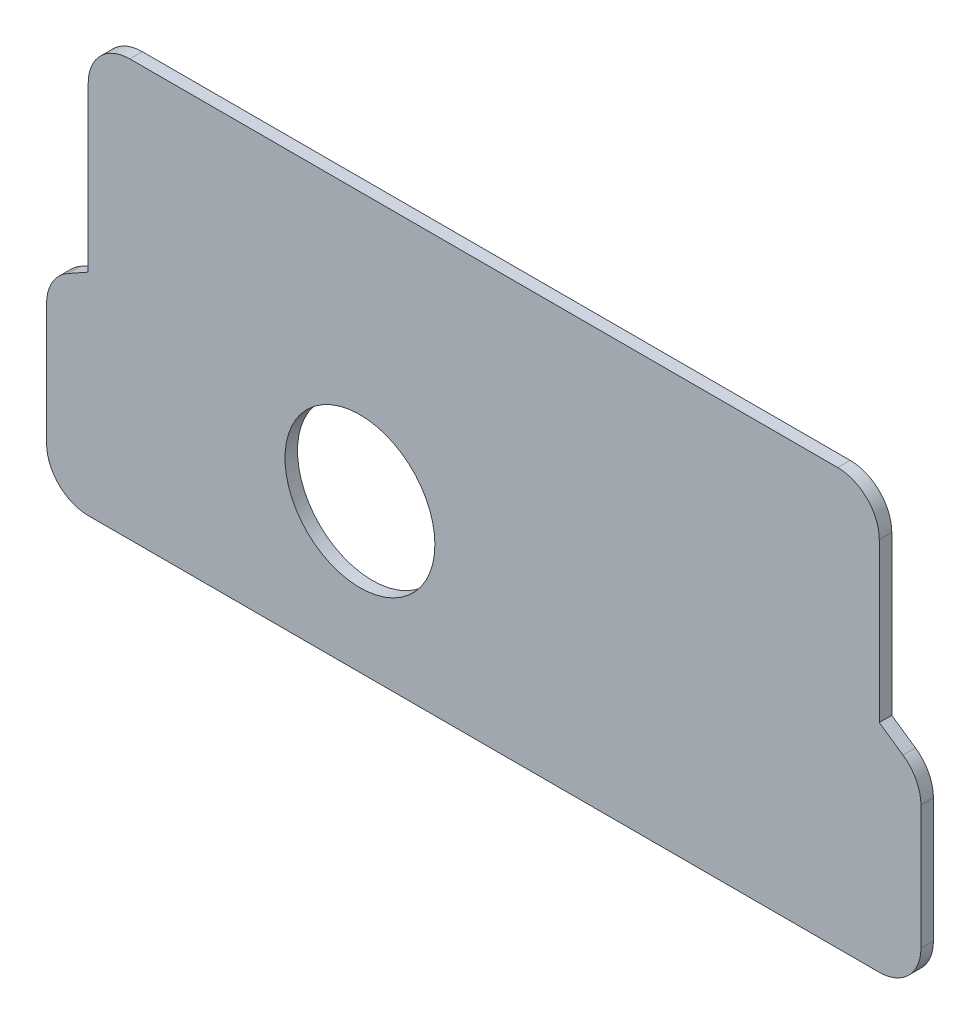
ISO-10303-21;
HEADER;
FILE_DESCRIPTION(('STEP AP214'),'2;1');
FILE_NAME('part.step','',(''),(''),'','','');
FILE_SCHEMA(('AUTOMOTIVE_DESIGN { 1 0 10303 214 1 1 1 1 }'));
ENDSEC;
DATA;
#1=APPLICATION_CONTEXT('core data for automotive mechanical design processes');
#2=APPLICATION_PROTOCOL_DEFINITION('international standard','automotive_design',2000,#1);
#3=PRODUCT_CONTEXT('',#1,'mechanical');
#4=PRODUCT('Part','Part','',(#3));
#5=PRODUCT_RELATED_PRODUCT_CATEGORY('part','',(#4));
#6=PRODUCT_DEFINITION_FORMATION('','',#4);
#7=PRODUCT_DEFINITION_CONTEXT('part definition',#1,'design');
#8=PRODUCT_DEFINITION('design','',#6,#7);
#9=PRODUCT_DEFINITION_SHAPE('','',#8);
#10=(LENGTH_UNIT() NAMED_UNIT(*) SI_UNIT(.MILLI.,.METRE.));
#11=(NAMED_UNIT(*) PLANE_ANGLE_UNIT() SI_UNIT($,.RADIAN.));
#12=(NAMED_UNIT(*) SI_UNIT($,.STERADIAN.) SOLID_ANGLE_UNIT());
#13=UNCERTAINTY_MEASURE_WITH_UNIT(LENGTH_MEASURE(1.E-05),#10,'distance_accuracy_value','');
#14=(GEOMETRIC_REPRESENTATION_CONTEXT(3) GLOBAL_UNCERTAINTY_ASSIGNED_CONTEXT((#13)) GLOBAL_UNIT_ASSIGNED_CONTEXT((#10,
#11,#12)) REPRESENTATION_CONTEXT('',''));
#15=CARTESIAN_POINT('',(0.,0.,0.));
#16=DIRECTION('',(0.,0.,1.));
#17=DIRECTION('',(1.,0.,0.));
#18=AXIS2_PLACEMENT_3D('',#15,#16,#17);
#19=CARTESIAN_POINT('',(200.,10.,3.));
#20=DIRECTION('',(0.,0.,-1.));
#21=DIRECTION('',(-1.,0.,0.));
#22=AXIS2_PLACEMENT_3D('',#19,#20,#21);
#23=PLANE('',#22);
#24=CARTESIAN_POINT('',(200.,10.,3.));
#25=DIRECTION('',(0.,0.,1.));
#26=DIRECTION('',(-1.,0.,0.));
#27=AXIS2_PLACEMENT_3D('',#24,#25,#26);
#28=CIRCLE('',#27,10.);
#29=CARTESIAN_POINT('',(200.,0.,3.));
#30=VERTEX_POINT('',#29);
#31=CARTESIAN_POINT('',(210.,10.,3.));
#32=VERTEX_POINT('',#31);
#33=EDGE_CURVE('E200',#30,#32,#28,.T.);
#34=ORIENTED_EDGE('',*,*,#33,.T.);
#35=DIRECTION('',(0.,1.,0.));
#36=VECTOR('',#35,1.);
#37=CARTESIAN_POINT('',(210.,39.8097786950727,3.));
#38=LINE('',#37,#36);
#39=CARTESIAN_POINT('',(210.,39.8097786950727,3.));
#40=VERTEX_POINT('',#39);
#41=EDGE_CURVE('E118',#32,#40,#38,.T.);
#42=ORIENTED_EDGE('',*,*,#41,.T.);
#43=CARTESIAN_POINT('',(200.,39.8097786950727,3.));
#44=DIRECTION('',(0.,0.,1.));
#45=DIRECTION('',(-1.,0.,0.));
#46=AXIS2_PLACEMENT_3D('',#43,#44,#45);
#47=CIRCLE('',#46,10.);
#48=CARTESIAN_POINT('',(205.683304945052,48.0377823959437,3.));
#49=VERTEX_POINT('',#48);
#50=EDGE_CURVE('E233',#40,#49,#47,.T.);
#51=ORIENTED_EDGE('',*,*,#50,.T.);
#52=DIRECTION('',(-0.8228003700871,0.568330494505206,0.));
#53=VECTOR('',#52,1.);
#54=CARTESIAN_POINT('',(200.,51.9633950077895,3.));
#55=LINE('',#54,#53);
#56=CARTESIAN_POINT('',(200.,51.9633950077895,3.));
#57=VERTEX_POINT('',#56);
#58=EDGE_CURVE('E252',#49,#57,#55,.T.);
#59=ORIENTED_EDGE('',*,*,#58,.T.);
#60=DIRECTION('',(0.,1.,0.));
#61=VECTOR('',#60,1.);
#62=CARTESIAN_POINT('',(200.,90.,3.));
#63=LINE('',#62,#61);
#64=CARTESIAN_POINT('',(200.,90.,3.));
#65=VERTEX_POINT('',#64);
#66=EDGE_CURVE('E249',#57,#65,#63,.T.);
#67=ORIENTED_EDGE('',*,*,#66,.T.);
#68=CARTESIAN_POINT('',(190.,90.,3.));
#69=DIRECTION('',(0.,0.,1.));
#70=DIRECTION('',(-1.,0.,0.));
#71=AXIS2_PLACEMENT_3D('',#68,#69,#70);
#72=CIRCLE('',#71,10.);
#73=CARTESIAN_POINT('',(190.,100.,3.));
#74=VERTEX_POINT('',#73);
#75=EDGE_CURVE('E251',#65,#74,#72,.T.);
#76=ORIENTED_EDGE('',*,*,#75,.T.);
#77=DIRECTION('',(-1.,0.,0.));
#78=VECTOR('',#77,1.);
#79=CARTESIAN_POINT('',(20.,100.,3.));
#80=LINE('',#79,#78);
#81=CARTESIAN_POINT('',(20.,100.,3.));
#82=VERTEX_POINT('',#81);
#83=EDGE_CURVE('E254',#74,#82,#80,.T.);
#84=ORIENTED_EDGE('',*,*,#83,.T.);
#85=CARTESIAN_POINT('',(20.,90.,3.));
#86=DIRECTION('',(0.,0.,1.));
#87=DIRECTION('',(-1.,0.,0.));
#88=AXIS2_PLACEMENT_3D('',#85,#86,#87);
#89=CIRCLE('',#88,10.);
#90=CARTESIAN_POINT('',(9.99999999999999,90.,3.));
#91=VERTEX_POINT('',#90);
#92=EDGE_CURVE('E260',#82,#91,#89,.T.);
#93=ORIENTED_EDGE('',*,*,#92,.T.);
#94=DIRECTION('',(0.,-1.,0.));
#95=VECTOR('',#94,1.);
#96=CARTESIAN_POINT('',(10.,50.6398805839343,3.));
#97=LINE('',#96,#95);
#98=CARTESIAN_POINT('',(10.,50.6398805839343,3.));
#99=VERTEX_POINT('',#98);
#100=EDGE_CURVE('E262',#91,#99,#97,.T.);
#101=ORIENTED_EDGE('',*,*,#100,.T.);
#102=DIRECTION('',(-0.873109961084315,-0.487523328524232,0.));
#103=VECTOR('',#102,1.);
#104=CARTESIAN_POINT('',(5.12476671475769,47.917669104865,3.));
#105=LINE('',#104,#103);
#106=CARTESIAN_POINT('',(5.12476671475769,47.917669104865,3.));
#107=VERTEX_POINT('',#106);
#108=EDGE_CURVE('E264',#99,#107,#105,.T.);
#109=ORIENTED_EDGE('',*,*,#108,.T.);
#110=CARTESIAN_POINT('',(10.,39.1865694940218,3.));
#111=DIRECTION('',(0.,0.,1.));
#112=DIRECTION('',(-1.,0.,0.));
#113=AXIS2_PLACEMENT_3D('',#110,#111,#112);
#114=CIRCLE('',#113,10.);
#115=CARTESIAN_POINT('',(0.,39.1865694940218,3.));
#116=VERTEX_POINT('',#115);
#117=EDGE_CURVE('E155',#107,#116,#114,.T.);
#118=ORIENTED_EDGE('',*,*,#117,.T.);
#119=DIRECTION('',(0.,-1.,0.));
#120=VECTOR('',#119,1.);
#121=CARTESIAN_POINT('',(0.,10.0000000000001,3.));
#122=LINE('',#121,#120);
#123=CARTESIAN_POINT('',(0.,10.0000000000001,3.));
#124=VERTEX_POINT('',#123);
#125=EDGE_CURVE('E149',#116,#124,#122,.T.);
#126=ORIENTED_EDGE('',*,*,#125,.T.);
#127=CARTESIAN_POINT('',(10.,10.,3.));
#128=DIRECTION('',(0.,0.,1.));
#129=DIRECTION('',(1.,0.,0.));
#130=AXIS2_PLACEMENT_3D('',#127,#128,#129);
#131=CIRCLE('',#130,10.);
#132=CARTESIAN_POINT('',(10.0000000000001,0.,3.));
#133=VERTEX_POINT('',#132);
#134=EDGE_CURVE('E153',#124,#133,#131,.T.);
#135=ORIENTED_EDGE('',*,*,#134,.T.);
#136=DIRECTION('',(1.,0.,0.));
#137=VECTOR('',#136,1.);
#138=CARTESIAN_POINT('',(200.,0.,3.));
#139=LINE('',#138,#137);
#140=EDGE_CURVE('E57',#133,#30,#139,.T.);
#141=ORIENTED_EDGE('',*,*,#140,.T.);
#142=EDGE_LOOP('',(#34,#42,#51,#59,#67,#76,#84,#93,#101,#109,#118,#126,#135,#141));
#143=FACE_BOUND('',#142,.T.);
#144=CARTESIAN_POINT('',(75.2645934030906,35.6224771845701,3.));
#145=DIRECTION('',(0.,0.,1.));
#146=DIRECTION('',(1.,0.,0.));
#147=AXIS2_PLACEMENT_3D('',#144,#145,#146);
#148=CIRCLE('',#147,17.9999999999993);
#149=CARTESIAN_POINT('',(93.2645934030898,35.6224771845701,3.));
#150=VERTEX_POINT('',#149);
#151=EDGE_CURVE('E177',#150,#150,#148,.T.);
#152=ORIENTED_EDGE('',*,*,#151,.F.);
#153=EDGE_LOOP('',(#152));
#154=FACE_BOUND('',#153,.T.);
#155=ADVANCED_FACE('F40',(#143,#154),#23,.F.);
#156=CARTESIAN_POINT('',(200.,10.,0.));
#157=DIRECTION('',(0.,0.,-1.));
#158=DIRECTION('',(-1.,0.,0.));
#159=AXIS2_PLACEMENT_3D('',#156,#157,#158);
#160=PLANE('',#159);
#161=CARTESIAN_POINT('',(200.,10.,0.));
#162=DIRECTION('',(0.,0.,1.));
#163=DIRECTION('',(-1.,0.,0.));
#164=AXIS2_PLACEMENT_3D('',#161,#162,#163);
#165=CIRCLE('',#164,10.);
#166=CARTESIAN_POINT('',(200.,0.,0.));
#167=VERTEX_POINT('',#166);
#168=CARTESIAN_POINT('',(210.,10.,0.));
#169=VERTEX_POINT('',#168);
#170=EDGE_CURVE('E173',#167,#169,#165,.T.);
#171=ORIENTED_EDGE('',*,*,#170,.F.);
#172=DIRECTION('',(1.,0.,0.));
#173=VECTOR('',#172,1.);
#174=CARTESIAN_POINT('',(200.,0.,0.));
#175=LINE('',#174,#173);
#176=CARTESIAN_POINT('',(10.0000000000001,0.,0.));
#177=VERTEX_POINT('',#176);
#178=EDGE_CURVE('E110',#177,#167,#175,.T.);
#179=ORIENTED_EDGE('',*,*,#178,.F.);
#180=CARTESIAN_POINT('',(10.,10.,0.));
#181=DIRECTION('',(0.,0.,1.));
#182=DIRECTION('',(1.,0.,0.));
#183=AXIS2_PLACEMENT_3D('',#180,#181,#182);
#184=CIRCLE('',#183,10.);
#185=CARTESIAN_POINT('',(0.,10.0000000000001,0.));
#186=VERTEX_POINT('',#185);
#187=EDGE_CURVE('E104',#186,#177,#184,.T.);
#188=ORIENTED_EDGE('',*,*,#187,.F.);
#189=DIRECTION('',(0.,-1.,0.));
#190=VECTOR('',#189,1.);
#191=CARTESIAN_POINT('',(0.,10.0000000000001,0.));
#192=LINE('',#191,#190);
#193=CARTESIAN_POINT('',(0.,39.1865694940218,0.));
#194=VERTEX_POINT('',#193);
#195=EDGE_CURVE('E163',#194,#186,#192,.T.);
#196=ORIENTED_EDGE('',*,*,#195,.F.);
#197=CARTESIAN_POINT('',(10.,39.1865694940218,0.));
#198=DIRECTION('',(0.,0.,1.));
#199=DIRECTION('',(-1.,0.,0.));
#200=AXIS2_PLACEMENT_3D('',#197,#198,#199);
#201=CIRCLE('',#200,10.);
#202=CARTESIAN_POINT('',(5.12476671475769,47.917669104865,0.));
#203=VERTEX_POINT('',#202);
#204=EDGE_CURVE('E195',#203,#194,#201,.T.);
#205=ORIENTED_EDGE('',*,*,#204,.F.);
#206=DIRECTION('',(-0.873109961084315,-0.487523328524232,0.));
#207=VECTOR('',#206,1.);
#208=CARTESIAN_POINT('',(5.12476671475769,47.917669104865,0.));
#209=LINE('',#208,#207);
#210=CARTESIAN_POINT('',(10.,50.6398805839343,0.));
#211=VERTEX_POINT('',#210);
#212=EDGE_CURVE('E193',#211,#203,#209,.T.);
#213=ORIENTED_EDGE('',*,*,#212,.F.);
#214=DIRECTION('',(0.,-1.,0.));
#215=VECTOR('',#214,1.);
#216=CARTESIAN_POINT('',(10.,50.6398805839343,0.));
#217=LINE('',#216,#215);
#218=CARTESIAN_POINT('',(9.99999999999999,90.,0.));
#219=VERTEX_POINT('',#218);
#220=EDGE_CURVE('E191',#219,#211,#217,.T.);
#221=ORIENTED_EDGE('',*,*,#220,.F.);
#222=CARTESIAN_POINT('',(20.,90.,0.));
#223=DIRECTION('',(0.,0.,1.));
#224=DIRECTION('',(-1.,0.,0.));
#225=AXIS2_PLACEMENT_3D('',#222,#223,#224);
#226=CIRCLE('',#225,10.);
#227=CARTESIAN_POINT('',(20.,100.,0.));
#228=VERTEX_POINT('',#227);
#229=EDGE_CURVE('E189',#228,#219,#226,.T.);
#230=ORIENTED_EDGE('',*,*,#229,.F.);
#231=DIRECTION('',(-1.,0.,0.));
#232=VECTOR('',#231,1.);
#233=CARTESIAN_POINT('',(20.,100.,0.));
#234=LINE('',#233,#232);
#235=CARTESIAN_POINT('',(190.,100.,0.));
#236=VERTEX_POINT('',#235);
#237=EDGE_CURVE('E187',#236,#228,#234,.T.);
#238=ORIENTED_EDGE('',*,*,#237,.F.);
#239=CARTESIAN_POINT('',(190.,90.,0.));
#240=DIRECTION('',(0.,0.,1.));
#241=DIRECTION('',(-1.,0.,0.));
#242=AXIS2_PLACEMENT_3D('',#239,#240,#241);
#243=CIRCLE('',#242,10.);
#244=CARTESIAN_POINT('',(200.,90.,0.));
#245=VERTEX_POINT('',#244);
#246=EDGE_CURVE('E185',#245,#236,#243,.T.);
#247=ORIENTED_EDGE('',*,*,#246,.F.);
#248=DIRECTION('',(0.,1.,0.));
#249=VECTOR('',#248,1.);
#250=CARTESIAN_POINT('',(200.,90.,0.));
#251=LINE('',#250,#249);
#252=CARTESIAN_POINT('',(200.,51.9633950077895,0.));
#253=VERTEX_POINT('',#252);
#254=EDGE_CURVE('E183',#253,#245,#251,.T.);
#255=ORIENTED_EDGE('',*,*,#254,.F.);
#256=DIRECTION('',(-0.8228003700871,0.568330494505206,0.));
#257=VECTOR('',#256,1.);
#258=CARTESIAN_POINT('',(200.,51.9633950077895,0.));
#259=LINE('',#258,#257);
#260=CARTESIAN_POINT('',(205.683304945052,48.0377823959437,0.));
#261=VERTEX_POINT('',#260);
#262=EDGE_CURVE('E181',#261,#253,#259,.T.);
#263=ORIENTED_EDGE('',*,*,#262,.F.);
#264=CARTESIAN_POINT('',(200.,39.8097786950727,0.));
#265=DIRECTION('',(0.,0.,1.));
#266=DIRECTION('',(-1.,0.,0.));
#267=AXIS2_PLACEMENT_3D('',#264,#265,#266);
#268=CIRCLE('',#267,10.);
#269=CARTESIAN_POINT('',(210.,39.8097786950727,0.));
#270=VERTEX_POINT('',#269);
#271=EDGE_CURVE('E179',#270,#261,#268,.T.);
#272=ORIENTED_EDGE('',*,*,#271,.F.);
#273=DIRECTION('',(0.,1.,0.));
#274=VECTOR('',#273,1.);
#275=CARTESIAN_POINT('',(210.,39.8097786950727,0.));
#276=LINE('',#275,#274);
#277=EDGE_CURVE('E176',#169,#270,#276,.T.);
#278=ORIENTED_EDGE('',*,*,#277,.F.);
#279=EDGE_LOOP('',(#171,#179,#188,#196,#205,#213,#221,#230,#238,#247,#255,#263,#272,#278));
#280=FACE_BOUND('',#279,.T.);
#281=CARTESIAN_POINT('',(75.2645934030906,35.6224771845701,0.));
#282=DIRECTION('',(0.,0.,1.));
#283=DIRECTION('',(1.,0.,0.));
#284=AXIS2_PLACEMENT_3D('',#281,#282,#283);
#285=CIRCLE('',#284,17.9999999999993);
#286=CARTESIAN_POINT('',(93.2645934030898,35.6224771845701,0.));
#287=VERTEX_POINT('',#286);
#288=EDGE_CURVE('E437',#287,#287,#285,.T.);
#289=ORIENTED_EDGE('',*,*,#288,.T.);
#290=EDGE_LOOP('',(#289));
#291=FACE_BOUND('',#290,.T.);
#292=ADVANCED_FACE('F237',(#280,#291),#160,.T.);
#293=CARTESIAN_POINT('',(200.,10.,3.));
#294=DIRECTION('',(0.,0.,-1.));
#295=DIRECTION('',(-1.,0.,0.));
#296=AXIS2_PLACEMENT_3D('',#293,#294,#295);
#297=CYLINDRICAL_SURFACE('',#296,10.);
#298=ORIENTED_EDGE('',*,*,#170,.T.);
#299=DIRECTION('',(0.,0.,-1.));
#300=VECTOR('',#299,1.);
#301=CARTESIAN_POINT('',(210.,10.,3.));
#302=LINE('',#301,#300);
#303=EDGE_CURVE('E11',#32,#169,#302,.T.);
#304=ORIENTED_EDGE('',*,*,#303,.F.);
#305=ORIENTED_EDGE('',*,*,#33,.F.);
#306=DIRECTION('',(0.,0.,-1.));
#307=VECTOR('',#306,1.);
#308=CARTESIAN_POINT('',(200.,0.,3.));
#309=LINE('',#308,#307);
#310=EDGE_CURVE('E169',#30,#167,#309,.T.);
#311=ORIENTED_EDGE('',*,*,#310,.T.);
#312=EDGE_LOOP('',(#298,#304,#305,#311));
#313=FACE_BOUND('',#312,.T.);
#314=ADVANCED_FACE('F42',(#313),#297,.T.);
#315=CARTESIAN_POINT('',(210.,39.8097786950727,3.));
#316=DIRECTION('',(-1.,0.,0.));
#317=DIRECTION('',(0.,0.,1.));
#318=AXIS2_PLACEMENT_3D('',#315,#316,#317);
#319=PLANE('',#318);
#320=ORIENTED_EDGE('',*,*,#277,.T.);
#321=DIRECTION('',(0.,0.,-1.));
#322=VECTOR('',#321,1.);
#323=CARTESIAN_POINT('',(210.,39.8097786950727,3.));
#324=LINE('',#323,#322);
#325=EDGE_CURVE('E49',#40,#270,#324,.T.);
#326=ORIENTED_EDGE('',*,*,#325,.F.);
#327=ORIENTED_EDGE('',*,*,#41,.F.);
#328=ORIENTED_EDGE('',*,*,#303,.T.);
#329=EDGE_LOOP('',(#320,#326,#327,#328));
#330=FACE_BOUND('',#329,.T.);
#331=ADVANCED_FACE('F298',(#330),#319,.F.);
#332=CARTESIAN_POINT('',(200.,39.8097786950727,3.));
#333=DIRECTION('',(0.,0.,-1.));
#334=DIRECTION('',(-1.,0.,0.));
#335=AXIS2_PLACEMENT_3D('',#332,#333,#334);
#336=CYLINDRICAL_SURFACE('',#335,10.);
#337=ORIENTED_EDGE('',*,*,#271,.T.);
#338=DIRECTION('',(0.,0.,-1.));
#339=VECTOR('',#338,1.);
#340=CARTESIAN_POINT('',(205.683304945052,48.0377823959437,3.));
#341=LINE('',#340,#339);
#342=EDGE_CURVE('E225',#49,#261,#341,.T.);
#343=ORIENTED_EDGE('',*,*,#342,.F.);
#344=ORIENTED_EDGE('',*,*,#50,.F.);
#345=ORIENTED_EDGE('',*,*,#325,.T.);
#346=EDGE_LOOP('',(#337,#343,#344,#345));
#347=FACE_BOUND('',#346,.T.);
#348=ADVANCED_FACE('F231',(#347),#336,.T.);
#349=CARTESIAN_POINT('',(200.,51.9633950077895,3.));
#350=DIRECTION('',(-0.568330494505206,-0.8228003700871,0.));
#351=DIRECTION('',(0.8228003700871,-0.568330494505206,0.));
#352=AXIS2_PLACEMENT_3D('',#349,#350,#351);
#353=PLANE('',#352);
#354=ORIENTED_EDGE('',*,*,#262,.T.);
#355=DIRECTION('',(0.,0.,-1.));
#356=VECTOR('',#355,1.);
#357=CARTESIAN_POINT('',(200.,51.9633950077895,3.));
#358=LINE('',#357,#356);
#359=EDGE_CURVE('E222',#57,#253,#358,.T.);
#360=ORIENTED_EDGE('',*,*,#359,.F.);
#361=ORIENTED_EDGE('',*,*,#58,.F.);
#362=ORIENTED_EDGE('',*,*,#342,.T.);
#363=EDGE_LOOP('',(#354,#360,#361,#362));
#364=FACE_BOUND('',#363,.T.);
#365=ADVANCED_FACE('F243',(#364),#353,.F.);
#366=CARTESIAN_POINT('',(200.,90.,3.));
#367=DIRECTION('',(-1.,0.,0.));
#368=DIRECTION('',(0.,0.,1.));
#369=AXIS2_PLACEMENT_3D('',#366,#367,#368);
#370=PLANE('',#369);
#371=ORIENTED_EDGE('',*,*,#254,.T.);
#372=DIRECTION('',(0.,0.,-1.));
#373=VECTOR('',#372,1.);
#374=CARTESIAN_POINT('',(200.,90.,3.));
#375=LINE('',#374,#373);
#376=EDGE_CURVE('E219',#65,#245,#375,.T.);
#377=ORIENTED_EDGE('',*,*,#376,.F.);
#378=ORIENTED_EDGE('',*,*,#66,.F.);
#379=ORIENTED_EDGE('',*,*,#359,.T.);
#380=EDGE_LOOP('',(#371,#377,#378,#379));
#381=FACE_BOUND('',#380,.T.);
#382=ADVANCED_FACE('F247',(#381),#370,.F.);
#383=CARTESIAN_POINT('',(190.,90.,3.));
#384=DIRECTION('',(0.,0.,-1.));
#385=DIRECTION('',(-1.,0.,0.));
#386=AXIS2_PLACEMENT_3D('',#383,#384,#385);
#387=CYLINDRICAL_SURFACE('',#386,10.);
#388=ORIENTED_EDGE('',*,*,#246,.T.);
#389=DIRECTION('',(0.,0.,-1.));
#390=VECTOR('',#389,1.);
#391=CARTESIAN_POINT('',(190.,100.,3.));
#392=LINE('',#391,#390);
#393=EDGE_CURVE('E216',#74,#236,#392,.T.);
#394=ORIENTED_EDGE('',*,*,#393,.F.);
#395=ORIENTED_EDGE('',*,*,#75,.F.);
#396=ORIENTED_EDGE('',*,*,#376,.T.);
#397=EDGE_LOOP('',(#388,#394,#395,#396));
#398=FACE_BOUND('',#397,.T.);
#399=ADVANCED_FACE('F311',(#398),#387,.T.);
#400=CARTESIAN_POINT('',(20.,100.,3.));
#401=DIRECTION('',(0.,-1.,0.));
#402=DIRECTION('',(1.,0.,0.));
#403=AXIS2_PLACEMENT_3D('',#400,#401,#402);
#404=PLANE('',#403);
#405=ORIENTED_EDGE('',*,*,#237,.T.);
#406=DIRECTION('',(0.,0.,-1.));
#407=VECTOR('',#406,1.);
#408=CARTESIAN_POINT('',(20.,100.,3.));
#409=LINE('',#408,#407);
#410=EDGE_CURVE('E213',#82,#228,#409,.T.);
#411=ORIENTED_EDGE('',*,*,#410,.F.);
#412=ORIENTED_EDGE('',*,*,#83,.F.);
#413=ORIENTED_EDGE('',*,*,#393,.T.);
#414=EDGE_LOOP('',(#405,#411,#412,#413));
#415=FACE_BOUND('',#414,.T.);
#416=ADVANCED_FACE('F314',(#415),#404,.F.);
#417=CARTESIAN_POINT('',(20.,90.,3.));
#418=DIRECTION('',(0.,0.,-1.));
#419=DIRECTION('',(-1.,0.,0.));
#420=AXIS2_PLACEMENT_3D('',#417,#418,#419);
#421=CYLINDRICAL_SURFACE('',#420,10.);
#422=ORIENTED_EDGE('',*,*,#229,.T.);
#423=DIRECTION('',(0.,0.,-1.));
#424=VECTOR('',#423,1.);
#425=CARTESIAN_POINT('',(9.99999999999999,90.,3.));
#426=LINE('',#425,#424);
#427=EDGE_CURVE('E210',#91,#219,#426,.T.);
#428=ORIENTED_EDGE('',*,*,#427,.F.);
#429=ORIENTED_EDGE('',*,*,#92,.F.);
#430=ORIENTED_EDGE('',*,*,#410,.T.);
#431=EDGE_LOOP('',(#422,#428,#429,#430));
#432=FACE_BOUND('',#431,.T.);
#433=ADVANCED_FACE('F318',(#432),#421,.T.);
#434=CARTESIAN_POINT('',(10.,50.6398805839343,3.));
#435=DIRECTION('',(1.,0.,0.));
#436=DIRECTION('',(0.,1.,0.));
#437=AXIS2_PLACEMENT_3D('',#434,#435,#436);
#438=PLANE('',#437);
#439=ORIENTED_EDGE('',*,*,#220,.T.);
#440=DIRECTION('',(0.,0.,-1.));
#441=VECTOR('',#440,1.);
#442=CARTESIAN_POINT('',(10.,50.6398805839343,3.));
#443=LINE('',#442,#441);
#444=EDGE_CURVE('E207',#99,#211,#443,.T.);
#445=ORIENTED_EDGE('',*,*,#444,.F.);
#446=ORIENTED_EDGE('',*,*,#100,.F.);
#447=ORIENTED_EDGE('',*,*,#427,.T.);
#448=EDGE_LOOP('',(#439,#445,#446,#447));
#449=FACE_BOUND('',#448,.T.);
#450=ADVANCED_FACE('F322',(#449),#438,.F.);
#451=CARTESIAN_POINT('',(5.12476671475769,47.917669104865,3.));
#452=DIRECTION('',(0.487523328524232,-0.873109961084315,0.));
#453=DIRECTION('',(0.873109961084315,0.487523328524232,0.));
#454=AXIS2_PLACEMENT_3D('',#451,#452,#453);
#455=PLANE('',#454);
#456=ORIENTED_EDGE('',*,*,#212,.T.);
#457=DIRECTION('',(0.,0.,-1.));
#458=VECTOR('',#457,1.);
#459=CARTESIAN_POINT('',(5.12476671475769,47.917669104865,3.));
#460=LINE('',#459,#458);
#461=EDGE_CURVE('E204',#107,#203,#460,.T.);
#462=ORIENTED_EDGE('',*,*,#461,.F.);
#463=ORIENTED_EDGE('',*,*,#108,.F.);
#464=ORIENTED_EDGE('',*,*,#444,.T.);
#465=EDGE_LOOP('',(#456,#462,#463,#464));
#466=FACE_BOUND('',#465,.T.);
#467=ADVANCED_FACE('F270',(#466),#455,.F.);
#468=CARTESIAN_POINT('',(10.,39.1865694940218,3.));
#469=DIRECTION('',(0.,0.,-1.));
#470=DIRECTION('',(-1.,0.,0.));
#471=AXIS2_PLACEMENT_3D('',#468,#469,#470);
#472=CYLINDRICAL_SURFACE('',#471,10.);
#473=ORIENTED_EDGE('',*,*,#204,.T.);
#474=DIRECTION('',(0.,0.,-1.));
#475=VECTOR('',#474,1.);
#476=CARTESIAN_POINT('',(0.,39.1865694940218,3.));
#477=LINE('',#476,#475);
#478=EDGE_CURVE('E164',#116,#194,#477,.T.);
#479=ORIENTED_EDGE('',*,*,#478,.F.);
#480=ORIENTED_EDGE('',*,*,#117,.F.);
#481=ORIENTED_EDGE('',*,*,#461,.T.);
#482=EDGE_LOOP('',(#473,#479,#480,#481));
#483=FACE_BOUND('',#482,.T.);
#484=ADVANCED_FACE('F274',(#483),#472,.T.);
#485=CARTESIAN_POINT('',(0.,10.0000000000001,3.));
#486=DIRECTION('',(1.,0.,0.));
#487=DIRECTION('',(0.,0.,-1.));
#488=AXIS2_PLACEMENT_3D('',#485,#486,#487);
#489=PLANE('',#488);
#490=ORIENTED_EDGE('',*,*,#195,.T.);
#491=DIRECTION('',(0.,0.,-1.));
#492=VECTOR('',#491,1.);
#493=CARTESIAN_POINT('',(0.,10.0000000000001,3.));
#494=LINE('',#493,#492);
#495=EDGE_CURVE('E160',#124,#186,#494,.T.);
#496=ORIENTED_EDGE('',*,*,#495,.F.);
#497=ORIENTED_EDGE('',*,*,#125,.F.);
#498=ORIENTED_EDGE('',*,*,#478,.T.);
#499=EDGE_LOOP('',(#490,#496,#497,#498));
#500=FACE_BOUND('',#499,.T.);
#501=ADVANCED_FACE('F161',(#500),#489,.F.);
#502=CARTESIAN_POINT('',(10.,10.,3.));
#503=DIRECTION('',(0.,0.,-1.));
#504=DIRECTION('',(-1.,0.,0.));
#505=AXIS2_PLACEMENT_3D('',#502,#503,#504);
#506=CYLINDRICAL_SURFACE('',#505,10.);
#507=ORIENTED_EDGE('',*,*,#187,.T.);
#508=DIRECTION('',(0.,0.,-1.));
#509=VECTOR('',#508,1.);
#510=CARTESIAN_POINT('',(10.0000000000001,0.,3.));
#511=LINE('',#510,#509);
#512=EDGE_CURVE('E165',#133,#177,#511,.T.);
#513=ORIENTED_EDGE('',*,*,#512,.F.);
#514=ORIENTED_EDGE('',*,*,#134,.F.);
#515=ORIENTED_EDGE('',*,*,#495,.T.);
#516=EDGE_LOOP('',(#507,#513,#514,#515));
#517=FACE_BOUND('',#516,.T.);
#518=ADVANCED_FACE('F167',(#517),#506,.T.);
#519=CARTESIAN_POINT('',(200.,0.,3.));
#520=DIRECTION('',(0.,1.,0.));
#521=DIRECTION('',(-1.,0.,0.));
#522=AXIS2_PLACEMENT_3D('',#519,#520,#521);
#523=PLANE('',#522);
#524=ORIENTED_EDGE('',*,*,#178,.T.);
#525=ORIENTED_EDGE('',*,*,#310,.F.);
#526=ORIENTED_EDGE('',*,*,#140,.F.);
#527=ORIENTED_EDGE('',*,*,#512,.T.);
#528=EDGE_LOOP('',(#524,#525,#526,#527));
#529=FACE_BOUND('',#528,.T.);
#530=ADVANCED_FACE('F278',(#529),#523,.F.);
#531=CARTESIAN_POINT('',(75.2645934030906,35.6224771845701,3.));
#532=DIRECTION('',(0.,0.,-1.));
#533=DIRECTION('',(-1.,0.,0.));
#534=AXIS2_PLACEMENT_3D('',#531,#532,#533);
#535=CYLINDRICAL_SURFACE('',#534,17.9999999999993);
#536=ORIENTED_EDGE('',*,*,#151,.T.);
#537=EDGE_LOOP('',(#536));
#538=FACE_BOUND('',#537,.T.);
#539=ORIENTED_EDGE('',*,*,#288,.F.);
#540=EDGE_LOOP('',(#539));
#541=FACE_BOUND('',#540,.T.);
#542=ADVANCED_FACE('F280',(#538,#541),#535,.F.);
#543=CLOSED_SHELL('',(#155,#292,#314,#331,#348,#365,#382,#399,#416,#433,#450,#467,#484,#501,
#518,#530,#542));
#544=MANIFOLD_SOLID_BREP('B2',#543);
#545=ADVANCED_BREP_SHAPE_REPRESENTATION('',(#18,#544),#14);
#546=SHAPE_DEFINITION_REPRESENTATION(#9,#545);
ENDSEC;
END-ISO-10303-21;
